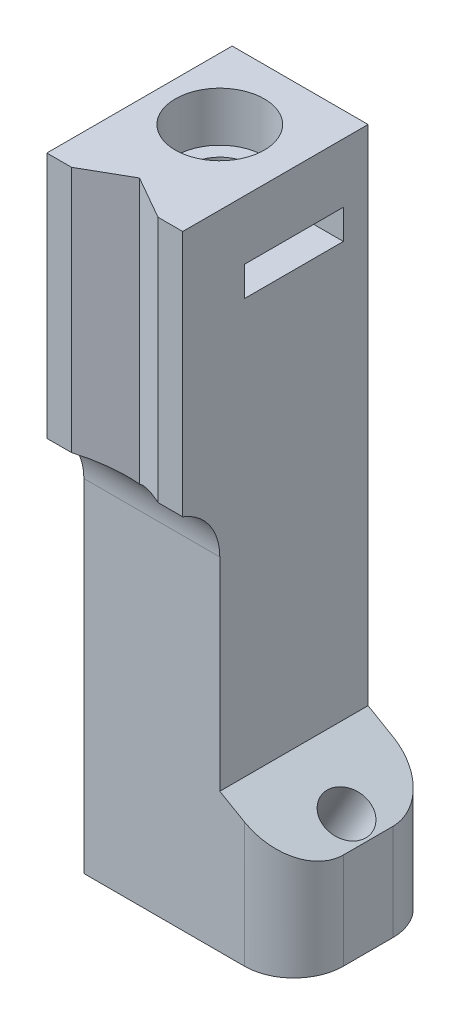
ISO-10303-21;
HEADER;
FILE_DESCRIPTION(('STEP AP214'),'2;1');
FILE_NAME('part.step','',(''),(''),'','','');
FILE_SCHEMA(('AUTOMOTIVE_DESIGN { 1 0 10303 214 1 1 1 1 }'));
ENDSEC;
DATA;
#1=APPLICATION_CONTEXT('core data for automotive mechanical design processes');
#2=APPLICATION_PROTOCOL_DEFINITION('international standard','automotive_design',2000,#1);
#3=PRODUCT_CONTEXT('',#1,'mechanical');
#4=PRODUCT('Part','Part','',(#3));
#5=PRODUCT_RELATED_PRODUCT_CATEGORY('part','',(#4));
#6=PRODUCT_DEFINITION_FORMATION('','',#4);
#7=PRODUCT_DEFINITION_CONTEXT('part definition',#1,'design');
#8=PRODUCT_DEFINITION('design','',#6,#7);
#9=PRODUCT_DEFINITION_SHAPE('','',#8);
#10=(LENGTH_UNIT() NAMED_UNIT(*) SI_UNIT(.MILLI.,.METRE.));
#11=(NAMED_UNIT(*) PLANE_ANGLE_UNIT() SI_UNIT($,.RADIAN.));
#12=(NAMED_UNIT(*) SI_UNIT($,.STERADIAN.) SOLID_ANGLE_UNIT());
#13=UNCERTAINTY_MEASURE_WITH_UNIT(LENGTH_MEASURE(1.E-05),#10,'distance_accuracy_value','');
#14=(GEOMETRIC_REPRESENTATION_CONTEXT(3) GLOBAL_UNCERTAINTY_ASSIGNED_CONTEXT((#13)) GLOBAL_UNIT_ASSIGNED_CONTEXT((#10,
#11,#12)) REPRESENTATION_CONTEXT('',''));
#15=CARTESIAN_POINT('',(0.,0.,0.));
#16=DIRECTION('',(0.,0.,1.));
#17=DIRECTION('',(1.,0.,0.));
#18=AXIS2_PLACEMENT_3D('',#15,#16,#17);
#19=CARTESIAN_POINT('',(2.50000000000003,19.75,0.));
#20=DIRECTION('',(0.,-1.,0.));
#21=DIRECTION('',(1.,0.,0.));
#22=AXIS2_PLACEMENT_3D('',#19,#20,#21);
#23=CYLINDRICAL_SURFACE('',#22,0.605);
#24=CARTESIAN_POINT('',(2.50000000000003,19.55,0.));
#25=DIRECTION('',(0.,1.,0.));
#26=DIRECTION('',(0.,0.,1.));
#27=AXIS2_PLACEMENT_3D('',#24,#25,#26);
#28=CIRCLE('',#27,0.605);
#29=CARTESIAN_POINT('',(2.50000000000003,19.55,0.605000000000023));
#30=VERTEX_POINT('',#29);
#31=EDGE_CURVE('E283',#30,#30,#28,.T.);
#32=ORIENTED_EDGE('',*,*,#31,.F.);
#33=EDGE_LOOP('',(#32));
#34=FACE_BOUND('',#33,.T.);
#35=CARTESIAN_POINT('',(2.50000000000003,19.75,0.));
#36=DIRECTION('',(0.,1.,0.));
#37=DIRECTION('',(-1.,0.,0.));
#38=AXIS2_PLACEMENT_3D('',#35,#36,#37);
#39=CIRCLE('',#38,0.605);
#40=CARTESIAN_POINT('',(1.89500000000003,19.75,0.));
#41=VERTEX_POINT('',#40);
#42=EDGE_CURVE('E365',#41,#41,#39,.T.);
#43=ORIENTED_EDGE('',*,*,#42,.T.);
#44=EDGE_LOOP('',(#43));
#45=FACE_BOUND('',#44,.T.);
#46=ADVANCED_FACE('F39',(#34,#45),#23,.F.);
#47=CARTESIAN_POINT('',(0.,0.,2.24999999996326));
#48=DIRECTION('',(0.,0.,-1.));
#49=DIRECTION('',(-1.,0.,0.));
#50=AXIS2_PLACEMENT_3D('',#47,#48,#49);
#51=PLANE('',#50);
#52=DIRECTION('',(1.,0.,0.));
#53=VECTOR('',#52,1.);
#54=CARTESIAN_POINT('',(4.00000000001019,15.75,2.24999999996326));
#55=LINE('',#54,#53);
#56=CARTESIAN_POINT('',(1.25000000001018,15.75,2.24999999996326));
#57=VERTEX_POINT('',#56);
#58=CARTESIAN_POINT('',(1.75000000001019,15.75,2.24999999996326));
#59=VERTEX_POINT('',#58);
#60=EDGE_CURVE('E409',#57,#59,#55,.T.);
#61=ORIENTED_EDGE('',*,*,#60,.T.);
#62=DIRECTION('',(0.,1.,0.));
#63=VECTOR('',#62,1.);
#64=CARTESIAN_POINT('',(1.75000000001014,0.,2.24999999996326));
#65=LINE('',#64,#63);
#66=CARTESIAN_POINT('',(1.7500000000102,20.75,2.24999999996327));
#67=VERTEX_POINT('',#66);
#68=EDGE_CURVE('E263',#59,#67,#65,.T.);
#69=ORIENTED_EDGE('',*,*,#68,.T.);
#70=DIRECTION('',(-1.,0.,0.));
#71=VECTOR('',#70,1.);
#72=CARTESIAN_POINT('',(4.00000000001018,20.75,2.24999999996326));
#73=LINE('',#72,#71);
#74=CARTESIAN_POINT('',(1.25000000001019,20.75,2.24999999996326));
#75=VERTEX_POINT('',#74);
#76=EDGE_CURVE('E422',#67,#75,#73,.T.);
#77=ORIENTED_EDGE('',*,*,#76,.T.);
#78=DIRECTION('',(0.,-1.,0.));
#79=VECTOR('',#78,1.);
#80=CARTESIAN_POINT('',(1.25000000001019,20.75,2.24999999996326));
#81=LINE('',#80,#79);
#82=EDGE_CURVE('E416',#75,#57,#81,.T.);
#83=ORIENTED_EDGE('',*,*,#82,.T.);
#84=EDGE_LOOP('',(#61,#69,#77,#83));
#85=FACE_BOUND('',#84,.T.);
#86=ADVANCED_FACE('F389',(#85),#51,.F.);
#87=CARTESIAN_POINT('',(0.,19.75,0.));
#88=DIRECTION('',(0.,1.,0.));
#89=DIRECTION('',(-1.,0.,0.));
#90=AXIS2_PLACEMENT_3D('',#87,#88,#89);
#91=PLANE('',#90);
#92=ORIENTED_EDGE('',*,*,#42,.F.);
#93=EDGE_LOOP('',(#92));
#94=FACE_BOUND('',#93,.T.);
#95=CARTESIAN_POINT('',(2.50000000000002,19.75,0.));
#96=DIRECTION('',(0.,1.,0.));
#97=DIRECTION('',(-1.,0.,0.));
#98=AXIS2_PLACEMENT_3D('',#95,#96,#97);
#99=CIRCLE('',#98,0.9);
#100=CARTESIAN_POINT('',(1.60000000000002,19.75,0.));
#101=VERTEX_POINT('',#100);
#102=EDGE_CURVE('E407',#101,#101,#99,.T.);
#103=ORIENTED_EDGE('',*,*,#102,.T.);
#104=EDGE_LOOP('',(#103));
#105=FACE_BOUND('',#104,.T.);
#106=ADVANCED_FACE('F395',(#94,#105),#91,.T.);
#107=CARTESIAN_POINT('',(0.,18.75,0.));
#108=DIRECTION('',(0.,1.,0.));
#109=DIRECTION('',(-1.,0.,0.));
#110=AXIS2_PLACEMENT_3D('',#107,#108,#109);
#111=PLANE('',#110);
#112=CARTESIAN_POINT('',(2.50000000000001,18.75,0.));
#113=DIRECTION('',(0.,1.,0.));
#114=DIRECTION('',(-1.,0.,0.));
#115=AXIS2_PLACEMENT_3D('',#112,#113,#114);
#116=CIRCLE('',#115,0.425);
#117=CARTESIAN_POINT('',(2.07500000000001,18.75,0.));
#118=VERTEX_POINT('',#117);
#119=EDGE_CURVE('E229',#118,#118,#116,.T.);
#120=ORIENTED_EDGE('',*,*,#119,.F.);
#121=EDGE_LOOP('',(#120));
#122=FACE_BOUND('',#121,.T.);
#123=CARTESIAN_POINT('',(2.50000000000003,18.75,0.));
#124=DIRECTION('',(0.,1.,0.));
#125=DIRECTION('',(-1.,0.,0.));
#126=AXIS2_PLACEMENT_3D('',#123,#124,#125);
#127=CIRCLE('',#126,0.605);
#128=CARTESIAN_POINT('',(1.89500000000003,18.75,0.));
#129=VERTEX_POINT('',#128);
#130=EDGE_CURVE('E359',#129,#129,#127,.T.);
#131=ORIENTED_EDGE('',*,*,#130,.T.);
#132=EDGE_LOOP('',(#131));
#133=FACE_BOUND('',#132,.T.);
#134=ADVANCED_FACE('F370',(#122,#133),#111,.T.);
#135=CARTESIAN_POINT('',(1.25000000001017,17.75,1.49999999996326));
#136=DIRECTION('',(-1.,0.,0.));
#137=DIRECTION('',(0.,0.,1.));
#138=AXIS2_PLACEMENT_3D('',#135,#136,#137);
#139=PLANE('',#138);
#140=DIRECTION('',(0.,-1.,0.));
#141=VECTOR('',#140,1.);
#142=CARTESIAN_POINT('',(1.25000000001017,18.95,-0.999999999963246));
#143=LINE('',#142,#141);
#144=CARTESIAN_POINT('',(1.25000000001017,19.55,-0.999999999963246));
#145=VERTEX_POINT('',#144);
#146=CARTESIAN_POINT('',(1.25000000001017,18.95,-0.999999999963245));
#147=VERTEX_POINT('',#146);
#148=EDGE_CURVE('E199',#145,#147,#143,.T.);
#149=ORIENTED_EDGE('',*,*,#148,.F.);
#150=DIRECTION('',(0.,0.,-1.));
#151=VECTOR('',#150,1.);
#152=CARTESIAN_POINT('',(1.25000000001017,19.55,-0.999999999963246));
#153=LINE('',#152,#151);
#154=CARTESIAN_POINT('',(1.25000000001017,19.55,1.00000000003675));
#155=VERTEX_POINT('',#154);
#156=EDGE_CURVE('E439',#155,#145,#153,.T.);
#157=ORIENTED_EDGE('',*,*,#156,.F.);
#158=DIRECTION('',(0.,1.,0.));
#159=VECTOR('',#158,1.);
#160=CARTESIAN_POINT('',(1.25000000001017,18.95,1.00000000003675));
#161=LINE('',#160,#159);
#162=CARTESIAN_POINT('',(1.25000000001017,18.95,1.00000000003675));
#163=VERTEX_POINT('',#162);
#164=EDGE_CURVE('E446',#163,#155,#161,.T.);
#165=ORIENTED_EDGE('',*,*,#164,.F.);
#166=DIRECTION('',(0.,0.,1.));
#167=VECTOR('',#166,1.);
#168=CARTESIAN_POINT('',(1.25000000001017,18.95,-0.999999999963246));
#169=LINE('',#168,#167);
#170=EDGE_CURVE('E449',#147,#163,#169,.T.);
#171=ORIENTED_EDGE('',*,*,#170,.F.);
#172=EDGE_LOOP('',(#149,#157,#165,#171));
#173=FACE_BOUND('',#172,.T.);
#174=DIRECTION('',(0.,0.,-1.));
#175=VECTOR('',#174,1.);
#176=CARTESIAN_POINT('',(1.25000000001017,7.75,1.49999999996326));
#177=LINE('',#176,#175);
#178=CARTESIAN_POINT('',(1.25000000001017,7.75,-0.787687442733548));
#179=VERTEX_POINT('',#178);
#180=CARTESIAN_POINT('',(1.25000000001017,7.75,-1.50000000003674));
#181=VERTEX_POINT('',#180);
#182=EDGE_CURVE('E232',#179,#181,#177,.T.);
#183=ORIENTED_EDGE('',*,*,#182,.F.);
#184=DIRECTION('',(0.,1.,0.));
#185=VECTOR('',#184,1.);
#186=CARTESIAN_POINT('',(1.25000000001017,17.75,-0.787687442733547));
#187=LINE('',#186,#185);
#188=CARTESIAN_POINT('',(1.25000000001017,17.75,-0.787687442733547));
#189=VERTEX_POINT('',#188);
#190=EDGE_CURVE('E225',#179,#189,#187,.T.);
#191=ORIENTED_EDGE('',*,*,#190,.T.);
#192=DIRECTION('',(0.,0.,1.));
#193=VECTOR('',#192,1.);
#194=CARTESIAN_POINT('',(1.25000000001017,17.75,1.49999999996326));
#195=LINE('',#194,#193);
#196=CARTESIAN_POINT('',(1.25000000001017,17.75,0.787687442733547));
#197=VERTEX_POINT('',#196);
#198=EDGE_CURVE('E257',#189,#197,#195,.T.);
#199=ORIENTED_EDGE('',*,*,#198,.T.);
#200=DIRECTION('',(0.,-1.,0.));
#201=VECTOR('',#200,1.);
#202=CARTESIAN_POINT('',(1.25000000001017,17.75,0.787687442733547));
#203=LINE('',#202,#201);
#204=CARTESIAN_POINT('',(1.25000000001017,7.75,0.787687442733547));
#205=VERTEX_POINT('',#204);
#206=EDGE_CURVE('E222',#197,#205,#203,.T.);
#207=ORIENTED_EDGE('',*,*,#206,.T.);
#208=CARTESIAN_POINT('',(1.25000000001017,7.75,1.49999999996326));
#209=VERTEX_POINT('',#208);
#210=EDGE_CURVE('E233',#209,#205,#177,.T.);
#211=ORIENTED_EDGE('',*,*,#210,.F.);
#212=DIRECTION('',(0.,-1.,0.));
#213=VECTOR('',#212,1.);
#214=CARTESIAN_POINT('',(1.25000000001017,17.75,1.49999999996326));
#215=LINE('',#214,#213);
#216=CARTESIAN_POINT('',(1.25000000001017,14.6718070673576,1.49999999996326));
#217=VERTEX_POINT('',#216);
#218=EDGE_CURVE('E242',#217,#209,#215,.T.);
#219=ORIENTED_EDGE('',*,*,#218,.F.);
#220=CARTESIAN_POINT('',(1.25000000001017,14.6718070673576,2.64999999996326));
#221=DIRECTION('',(-1.,0.,0.));
#222=DIRECTION('',(0.,0.,1.));
#223=AXIS2_PLACEMENT_3D('',#220,#221,#222);
#224=CIRCLE('',#223,1.15);
#225=EDGE_CURVE('E275',#217,#57,#224,.F.);
#226=ORIENTED_EDGE('',*,*,#225,.T.);
#227=ORIENTED_EDGE('',*,*,#82,.F.);
#228=DIRECTION('',(0.,0.,1.));
#229=VECTOR('',#228,1.);
#230=CARTESIAN_POINT('',(1.25000000001019,20.75,-1.49999999996325));
#231=LINE('',#230,#229);
#232=CARTESIAN_POINT('',(1.25000000001019,20.75,-1.49999999996325));
#233=VERTEX_POINT('',#232);
#234=EDGE_CURVE('E348',#233,#75,#231,.T.);
#235=ORIENTED_EDGE('',*,*,#234,.F.);
#236=DIRECTION('',(0.,-1.,0.));
#237=VECTOR('',#236,1.);
#238=CARTESIAN_POINT('',(1.25000000001017,17.75,-1.50000000003674));
#239=LINE('',#238,#237);
#240=EDGE_CURVE('E241',#233,#181,#239,.T.);
#241=ORIENTED_EDGE('',*,*,#240,.T.);
#242=EDGE_LOOP('',(#183,#191,#199,#207,#211,#219,#226,#227,#235,#241));
#243=FACE_BOUND('',#242,.T.);
#244=ADVANCED_FACE('F342',(#173,#243),#139,.T.);
#245=CARTESIAN_POINT('',(0.,7.75,0.));
#246=DIRECTION('',(0.,1.,0.));
#247=DIRECTION('',(0.,0.,1.));
#248=AXIS2_PLACEMENT_3D('',#245,#246,#247);
#249=PLANE('',#248);
#250=CARTESIAN_POINT('',(2.5,7.75,0.));
#251=DIRECTION('',(0.,1.,0.));
#252=DIRECTION('',(0.,0.,-1.));
#253=AXIS2_PLACEMENT_3D('',#250,#251,#252);
#254=CIRCLE('',#253,0.825000000000001);
#255=CARTESIAN_POINT('',(2.47513758544198,7.75,0.824625284806587));
#256=VERTEX_POINT('',#255);
#257=CARTESIAN_POINT('',(3.3088331618986,7.75,0.162523586636277));
#258=VERTEX_POINT('',#257);
#259=EDGE_CURVE('E198',#256,#258,#254,.T.);
#260=ORIENTED_EDGE('',*,*,#259,.T.);
#261=CARTESIAN_POINT('',(3.79337567298423,7.75,0.));
#262=DIRECTION('',(0.,1.,0.));
#263=DIRECTION('',(1.,0.,0.));
#264=AXIS2_PLACEMENT_3D('',#261,#262,#263);
#265=ELLIPSE('',#264,0.519615242270661,0.45);
#266=CARTESIAN_POINT('',(3.3088331618986,7.75,-0.16252358663628));
#267=VERTEX_POINT('',#266);
#268=EDGE_CURVE('E53',#258,#267,#265,.T.);
#269=ORIENTED_EDGE('',*,*,#268,.T.);
#270=CARTESIAN_POINT('',(2.47513758544198,7.75,-0.824625284806589));
#271=VERTEX_POINT('',#270);
#272=EDGE_CURVE('E195',#267,#271,#254,.T.);
#273=ORIENTED_EDGE('',*,*,#272,.T.);
#274=DIRECTION('',(-0.99954579976556,0.,0.0301362600703328));
#275=VECTOR('',#274,1.);
#276=CARTESIAN_POINT('',(0.,7.75,-0.75));
#277=LINE('',#276,#275);
#278=EDGE_CURVE('E208',#271,#179,#277,.T.);
#279=ORIENTED_EDGE('',*,*,#278,.T.);
#280=ORIENTED_EDGE('',*,*,#182,.T.);
#281=DIRECTION('',(1.,0.,2.67195514451353E-11));
#282=VECTOR('',#281,1.);
#283=CARTESIAN_POINT('',(4.00000000001017,7.75,-1.49999999996326));
#284=LINE('',#283,#282);
#285=CARTESIAN_POINT('',(4.50000000003691,7.75,-1.4999999999499));
#286=VERTEX_POINT('',#285);
#287=EDGE_CURVE('E236',#181,#286,#284,.T.);
#288=ORIENTED_EDGE('',*,*,#287,.T.);
#289=CARTESIAN_POINT('',(4.50000000001019,7.75,-0.499999999949901));
#290=DIRECTION('',(0.,1.,0.));
#291=DIRECTION('',(0.,0.,1.));
#292=AXIS2_PLACEMENT_3D('',#289,#290,#291);
#293=CIRCLE('',#292,1.);
#294=CARTESIAN_POINT('',(5.50000000001019,7.75,-0.499999999949901));
#295=VERTEX_POINT('',#294);
#296=EDGE_CURVE('E47',#286,#295,#293,.F.);
#297=ORIENTED_EDGE('',*,*,#296,.T.);
#298=DIRECTION('',(0.,0.,1.));
#299=VECTOR('',#298,1.);
#300=CARTESIAN_POINT('',(5.50000000001019,7.75,-4.69061108165771));
#301=LINE('',#300,#299);
#302=CARTESIAN_POINT('',(5.50000000001019,7.75,0.499999999963262));
#303=VERTEX_POINT('',#302);
#304=EDGE_CURVE('E304',#295,#303,#301,.T.);
#305=ORIENTED_EDGE('',*,*,#304,.T.);
#306=CARTESIAN_POINT('',(4.50000000001019,7.75,0.499999999963261));
#307=DIRECTION('',(0.,1.,0.));
#308=DIRECTION('',(0.,0.,1.));
#309=AXIS2_PLACEMENT_3D('',#306,#307,#308);
#310=CIRCLE('',#309,1.);
#311=CARTESIAN_POINT('',(4.50000000001019,7.75,1.49999999996326));
#312=VERTEX_POINT('',#311);
#313=EDGE_CURVE('E61',#303,#312,#310,.F.);
#314=ORIENTED_EDGE('',*,*,#313,.T.);
#315=DIRECTION('',(-1.,0.,0.));
#316=VECTOR('',#315,1.);
#317=CARTESIAN_POINT('',(4.00000000001017,7.75,1.49999999996326));
#318=LINE('',#317,#316);
#319=EDGE_CURVE('E239',#312,#209,#318,.T.);
#320=ORIENTED_EDGE('',*,*,#319,.T.);
#321=ORIENTED_EDGE('',*,*,#210,.T.);
#322=DIRECTION('',(-0.99954579976556,0.,-0.0301362600703316));
#323=VECTOR('',#322,1.);
#324=CARTESIAN_POINT('',(-0.0225919291304569,7.75,0.749318854371731));
#325=LINE('',#324,#323);
#326=EDGE_CURVE('E245',#256,#205,#325,.T.);
#327=ORIENTED_EDGE('',*,*,#326,.F.);
#328=EDGE_LOOP('',(#260,#269,#273,#279,#280,#288,#297,#305,#314,#320,#321,#327));
#329=FACE_BOUND('',#328,.T.);
#330=ADVANCED_FACE('F193',(#329),#249,.F.);
#331=CARTESIAN_POINT('',(4.00000000001017,17.75,1.49999999996326));
#332=DIRECTION('',(0.,0.,1.));
#333=DIRECTION('',(1.,0.,0.));
#334=AXIS2_PLACEMENT_3D('',#331,#332,#333);
#335=PLANE('',#334);
#336=ORIENTED_EDGE('',*,*,#319,.F.);
#337=DIRECTION('',(0.,1.,0.));
#338=VECTOR('',#337,1.);
#339=CARTESIAN_POINT('',(4.50000000001019,17.75,1.49999999996326));
#340=LINE('',#339,#338);
#341=CARTESIAN_POINT('',(4.50000000001019,10.2773502691896,1.49999999996326));
#342=VERTEX_POINT('',#341);
#343=EDGE_CURVE('E11',#312,#342,#340,.T.);
#344=ORIENTED_EDGE('',*,*,#343,.T.);
#345=DIRECTION('',(-0.866025403784443,0.499999999999993,0.));
#346=VECTOR('',#345,1.);
#347=CARTESIAN_POINT('',(5.5000000000102,9.7,1.49999999996326));
#348=LINE('',#347,#346);
#349=CARTESIAN_POINT('',(4.00000000001018,10.5660254037844,1.49999999996326));
#350=VERTEX_POINT('',#349);
#351=EDGE_CURVE('E315',#342,#350,#348,.T.);
#352=ORIENTED_EDGE('',*,*,#351,.T.);
#353=DIRECTION('',(0.,-1.,0.));
#354=VECTOR('',#353,1.);
#355=CARTESIAN_POINT('',(4.00000000001017,17.75,1.49999999996326));
#356=LINE('',#355,#354);
#357=CARTESIAN_POINT('',(4.00000000001017,14.6718070673576,1.49999999996326));
#358=VERTEX_POINT('',#357);
#359=EDGE_CURVE('E246',#358,#350,#356,.T.);
#360=ORIENTED_EDGE('',*,*,#359,.F.);
#361=DIRECTION('',(1.,0.,0.));
#362=VECTOR('',#361,1.);
#363=CARTESIAN_POINT('',(1.25000000001017,14.6718070673576,1.49999999996326));
#364=LINE('',#363,#362);
#365=EDGE_CURVE('E266',#358,#217,#364,.F.);
#366=ORIENTED_EDGE('',*,*,#365,.T.);
#367=ORIENTED_EDGE('',*,*,#218,.T.);
#368=EDGE_LOOP('',(#336,#344,#352,#360,#366,#367));
#369=FACE_BOUND('',#368,.T.);
#370=ADVANCED_FACE('F666',(#369),#335,.T.);
#371=CARTESIAN_POINT('',(4.00000000001017,17.75,1.49999999996326));
#372=DIRECTION('',(1.,0.,0.));
#373=DIRECTION('',(0.,0.,-1.));
#374=AXIS2_PLACEMENT_3D('',#371,#372,#373);
#375=PLANE('',#374);
#376=DIRECTION('',(0.,1.,0.));
#377=VECTOR('',#376,1.);
#378=CARTESIAN_POINT('',(4.00000000001017,17.75,-0.999999999963246));
#379=LINE('',#378,#377);
#380=CARTESIAN_POINT('',(4.00000000001017,18.95,-0.999999999963246));
#381=VERTEX_POINT('',#380);
#382=CARTESIAN_POINT('',(4.00000000001017,19.55,-0.999999999963246));
#383=VERTEX_POINT('',#382);
#384=EDGE_CURVE('E289',#381,#383,#379,.T.);
#385=ORIENTED_EDGE('',*,*,#384,.F.);
#386=DIRECTION('',(0.,0.,-1.));
#387=VECTOR('',#386,1.);
#388=CARTESIAN_POINT('',(4.00000000001017,18.95,1.49999999996326));
#389=LINE('',#388,#387);
#390=CARTESIAN_POINT('',(4.00000000001017,18.95,1.00000000003675));
#391=VERTEX_POINT('',#390);
#392=EDGE_CURVE('E281',#391,#381,#389,.T.);
#393=ORIENTED_EDGE('',*,*,#392,.F.);
#394=DIRECTION('',(0.,-1.,0.));
#395=VECTOR('',#394,1.);
#396=CARTESIAN_POINT('',(4.00000000001017,17.75,1.00000000003675));
#397=LINE('',#396,#395);
#398=CARTESIAN_POINT('',(4.00000000001017,19.55,1.00000000003675));
#399=VERTEX_POINT('',#398);
#400=EDGE_CURVE('E277',#399,#391,#397,.T.);
#401=ORIENTED_EDGE('',*,*,#400,.F.);
#402=DIRECTION('',(0.,0.,1.));
#403=VECTOR('',#402,1.);
#404=CARTESIAN_POINT('',(4.00000000001017,19.55,1.49999999996326));
#405=LINE('',#404,#403);
#406=EDGE_CURVE('E286',#383,#399,#405,.T.);
#407=ORIENTED_EDGE('',*,*,#406,.F.);
#408=EDGE_LOOP('',(#385,#393,#401,#407));
#409=FACE_BOUND('',#408,.T.);
#410=DIRECTION('',(0.,0.,1.));
#411=VECTOR('',#410,1.);
#412=CARTESIAN_POINT('',(4.00000000001018,10.5660254037844,-4.69061108165771));
#413=LINE('',#412,#411);
#414=CARTESIAN_POINT('',(4.00000000001017,10.5660254037844,-1.49999999996326));
#415=VERTEX_POINT('',#414);
#416=EDGE_CURVE('E206',#415,#350,#413,.T.);
#417=ORIENTED_EDGE('',*,*,#416,.F.);
#418=DIRECTION('',(0.,-1.,0.));
#419=VECTOR('',#418,1.);
#420=CARTESIAN_POINT('',(4.00000000001017,17.75,-1.49999999996326));
#421=LINE('',#420,#419);
#422=CARTESIAN_POINT('',(4.00000000001019,20.75,-1.49999999996325));
#423=VERTEX_POINT('',#422);
#424=EDGE_CURVE('E249',#423,#415,#421,.T.);
#425=ORIENTED_EDGE('',*,*,#424,.F.);
#426=DIRECTION('',(0.,0.,-1.));
#427=VECTOR('',#426,1.);
#428=CARTESIAN_POINT('',(4.00000000001019,20.75,-1.49999999996325));
#429=LINE('',#428,#427);
#430=CARTESIAN_POINT('',(4.00000000001018,20.75,2.24999999996326));
#431=VERTEX_POINT('',#430);
#432=EDGE_CURVE('E357',#431,#423,#429,.T.);
#433=ORIENTED_EDGE('',*,*,#432,.F.);
#434=DIRECTION('',(0.,1.,0.));
#435=VECTOR('',#434,1.);
#436=CARTESIAN_POINT('',(4.00000000001018,20.75,2.24999999996326));
#437=LINE('',#436,#435);
#438=CARTESIAN_POINT('',(4.00000000001019,15.75,2.24999999996326));
#439=VERTEX_POINT('',#438);
#440=EDGE_CURVE('E423',#439,#431,#437,.T.);
#441=ORIENTED_EDGE('',*,*,#440,.F.);
#442=CARTESIAN_POINT('',(4.00000000001017,14.6718070673576,2.64999999996326));
#443=DIRECTION('',(1.,0.,0.));
#444=DIRECTION('',(0.,0.,-1.));
#445=AXIS2_PLACEMENT_3D('',#442,#443,#444);
#446=CIRCLE('',#445,1.15);
#447=EDGE_CURVE('E273',#439,#358,#446,.F.);
#448=ORIENTED_EDGE('',*,*,#447,.T.);
#449=ORIENTED_EDGE('',*,*,#359,.T.);
#450=EDGE_LOOP('',(#417,#425,#433,#441,#448,#449));
#451=FACE_BOUND('',#450,.T.);
#452=ADVANCED_FACE('F646',(#409,#451),#375,.T.);
#453=CARTESIAN_POINT('',(4.00000000001017,17.75,-1.49999999996326));
#454=DIRECTION('',(2.67195514451353E-11,0.,-1.));
#455=DIRECTION('',(-1.,0.,-2.67195514451353E-11));
#456=AXIS2_PLACEMENT_3D('',#453,#454,#455);
#457=PLANE('',#456);
#458=DIRECTION('',(-0.866025403784443,0.499999999999993,-2.31398103292125E-11));
#459=VECTOR('',#458,1.);
#460=CARTESIAN_POINT('',(5.49999999994626,9.70000000003692,-1.49999999992318));
#461=LINE('',#460,#459);
#462=CARTESIAN_POINT('',(4.50000000003691,10.2773502691742,-1.4999999999499));
#463=VERTEX_POINT('',#462);
#464=EDGE_CURVE('E210',#463,#415,#461,.T.);
#465=ORIENTED_EDGE('',*,*,#464,.F.);
#466=DIRECTION('',(0.,1.,0.));
#467=VECTOR('',#466,1.);
#468=CARTESIAN_POINT('',(4.50000000003691,17.75,-1.4999999999499));
#469=LINE('',#468,#467);
#470=EDGE_CURVE('E300',#463,#286,#469,.F.);
#471=ORIENTED_EDGE('',*,*,#470,.T.);
#472=ORIENTED_EDGE('',*,*,#287,.F.);
#473=ORIENTED_EDGE('',*,*,#240,.F.);
#474=DIRECTION('',(-1.,0.,0.));
#475=VECTOR('',#474,1.);
#476=CARTESIAN_POINT('',(4.00000000001019,20.75,-1.49999999996325));
#477=LINE('',#476,#475);
#478=EDGE_CURVE('E350',#423,#233,#477,.T.);
#479=ORIENTED_EDGE('',*,*,#478,.F.);
#480=ORIENTED_EDGE('',*,*,#424,.T.);
#481=EDGE_LOOP('',(#465,#471,#472,#473,#479,#480));
#482=FACE_BOUND('',#481,.T.);
#483=ADVANCED_FACE('F323',(#482),#457,.T.);
#484=CARTESIAN_POINT('',(2.50000000000001,18.75,0.));
#485=DIRECTION('',(0.,-1.,0.));
#486=DIRECTION('',(1.,0.,0.));
#487=AXIS2_PLACEMENT_3D('',#484,#485,#486);
#488=CYLINDRICAL_SURFACE('',#487,0.425);
#489=ORIENTED_EDGE('',*,*,#119,.T.);
#490=EDGE_LOOP('',(#489));
#491=FACE_BOUND('',#490,.T.);
#492=CARTESIAN_POINT('',(2.50000000000001,17.75,0.));
#493=DIRECTION('',(0.,1.,0.));
#494=DIRECTION('',(0.,0.,1.));
#495=AXIS2_PLACEMENT_3D('',#492,#493,#494);
#496=CIRCLE('',#495,0.425);
#497=CARTESIAN_POINT('',(2.50000000000001,17.75,0.425000000000002));
#498=VERTEX_POINT('',#497);
#499=EDGE_CURVE('E228',#498,#498,#496,.F.);
#500=ORIENTED_EDGE('',*,*,#499,.T.);
#501=EDGE_LOOP('',(#500));
#502=FACE_BOUND('',#501,.T.);
#503=ADVANCED_FACE('F632',(#491,#502),#488,.F.);
#504=CARTESIAN_POINT('',(2.5,17.75,0.));
#505=DIRECTION('',(0.,-1.,0.));
#506=DIRECTION('',(0.,0.,-1.));
#507=AXIS2_PLACEMENT_3D('',#504,#505,#506);
#508=CYLINDRICAL_SURFACE('',#507,0.825000000000001);
#509=CARTESIAN_POINT('',(3.3088331618986,7.75,0.162523586636281));
#510=CARTESIAN_POINT('',(3.31130298301363,7.76381074017904,0.150157062556384));
#511=CARTESIAN_POINT('',(3.31371865886534,7.77717541121343,0.136734291079579));
#512=CARTESIAN_POINT('',(3.31813522489229,7.80146061221009,0.107301244271355));
#513=CARTESIAN_POINT('',(3.32012536097923,7.81231822855201,0.0912387966053799));
#514=CARTESIAN_POINT('',(3.32241990837611,7.8247883181701,0.0657054587576099));
#515=CARTESIAN_POINT('',(3.32306054392863,7.82826052689777,0.0572075590074394));
#516=CARTESIAN_POINT('',(3.32408501472451,7.83380672514012,0.0398053806079432));
#517=CARTESIAN_POINT('',(3.32447053671383,7.83588989931216,0.0309041955707023));
#518=CARTESIAN_POINT('',(3.32495108097547,7.8384857744639,0.0127802242978498));
#519=CARTESIAN_POINT('',(3.32504351428764,7.83898447931983,0.00355529577785323));
#520=CARTESIAN_POINT('',(3.32491787803019,7.83830615950752,-0.0148426444433378));
#521=CARTESIAN_POINT('',(3.32469934621167,7.83712664016349,-0.0240155584629134));
#522=CARTESIAN_POINT('',(3.32400506441491,7.83337350277898,-0.0413613621300416));
#523=CARTESIAN_POINT('',(3.32354887941204,7.83090589989695,-0.0495587976920373));
#524=CARTESIAN_POINT('',(3.32243358604487,7.82486094685297,-0.0655138902923301));
#525=CARTESIAN_POINT('',(3.32177437328802,7.82128302578184,-0.0732713186527857));
#526=CARTESIAN_POINT('',(3.3197627826597,7.81033709213271,-0.0937188300484667));
#527=CARTESIAN_POINT('',(3.31825366653092,7.80209822471133,-0.105924289415646));
#528=CARTESIAN_POINT('',(3.31494523566545,7.78392951620601,-0.128940250959091));
#529=CARTESIAN_POINT('',(3.31314523829414,7.77399569429561,-0.139747361381362));
#530=CARTESIAN_POINT('',(3.31046334897833,7.75909499018411,-0.154248139016151));
#531=CARTESIAN_POINT('',(3.30965396934797,7.75458618683261,-0.158434434744402));
#532=CARTESIAN_POINT('',(3.3088331618986,7.75000000000001,-0.162523586636297));
#533=B_SPLINE_CURVE_WITH_KNOTS('',3,(#509,#510,#511,#512,#513,#514,#515,#516,#517,#518,#519,
#520,#521,#522,#523,#524,#525,#526,#527,#528,#529,#530,#531,#532),.UNSPECIFIED.,.F.,.F.,(4,2,2,
2,2,2,2,2,2,2,2,4),(0.,0.0566776770472456,0.114652052950472,0.142154106852181,0.169472457382965,
0.197031458225634,0.224631468275562,0.25025265466321,0.275887036975723,0.320038341536252,
0.364294805787561,0.382901662172596),.UNSPECIFIED.);
#534=EDGE_CURVE('E186',#258,#267,#533,.T.);
#535=ORIENTED_EDGE('',*,*,#534,.F.);
#536=ORIENTED_EDGE('',*,*,#259,.F.);
#537=DIRECTION('',(0.,-1.,0.));
#538=VECTOR('',#537,1.);
#539=CARTESIAN_POINT('',(2.47513758544198,17.75,0.824625284806587));
#540=LINE('',#539,#538);
#541=CARTESIAN_POINT('',(2.47513758544198,17.75,0.824625284806587));
#542=VERTEX_POINT('',#541);
#543=EDGE_CURVE('E218',#542,#256,#540,.T.);
#544=ORIENTED_EDGE('',*,*,#543,.F.);
#545=CARTESIAN_POINT('',(2.5,17.75,0.));
#546=DIRECTION('',(0.,1.,0.));
#547=DIRECTION('',(0.,0.,-1.));
#548=AXIS2_PLACEMENT_3D('',#545,#546,#547);
#549=CIRCLE('',#548,0.825000000000001);
#550=CARTESIAN_POINT('',(2.47513758544198,17.75,-0.824625284806589));
#551=VERTEX_POINT('',#550);
#552=EDGE_CURVE('E217',#542,#551,#549,.T.);
#553=ORIENTED_EDGE('',*,*,#552,.T.);
#554=DIRECTION('',(0.,-1.,0.));
#555=VECTOR('',#554,1.);
#556=CARTESIAN_POINT('',(2.47513758544198,17.75,-0.824625284806589));
#557=LINE('',#556,#555);
#558=EDGE_CURVE('E205',#551,#271,#557,.T.);
#559=ORIENTED_EDGE('',*,*,#558,.T.);
#560=ORIENTED_EDGE('',*,*,#272,.F.);
#561=EDGE_LOOP('',(#535,#536,#544,#553,#559,#560));
#562=FACE_BOUND('',#561,.T.);
#563=ADVANCED_FACE('F202',(#562),#508,.F.);
#564=CARTESIAN_POINT('',(0.,17.75,-0.75));
#565=DIRECTION('',(0.0301362600703328,0.,0.99954579976556));
#566=DIRECTION('',(0.99954579976556,0.,-0.0301362600703328));
#567=AXIS2_PLACEMENT_3D('',#564,#565,#566);
#568=PLANE('',#567);
#569=ORIENTED_EDGE('',*,*,#278,.F.);
#570=ORIENTED_EDGE('',*,*,#558,.F.);
#571=DIRECTION('',(-0.99954579976556,0.,0.0301362600703328));
#572=VECTOR('',#571,1.);
#573=CARTESIAN_POINT('',(0.,17.75,-0.75));
#574=LINE('',#573,#572);
#575=EDGE_CURVE('E330',#551,#189,#574,.T.);
#576=ORIENTED_EDGE('',*,*,#575,.T.);
#577=ORIENTED_EDGE('',*,*,#190,.F.);
#578=EDGE_LOOP('',(#569,#570,#576,#577));
#579=FACE_BOUND('',#578,.T.);
#580=ADVANCED_FACE('F344',(#579),#568,.T.);
#581=CARTESIAN_POINT('',(0.,17.75,0.750000000000001));
#582=DIRECTION('',(0.0301362600703316,0.,-0.99954579976556));
#583=DIRECTION('',(-0.99954579976556,0.,-0.0301362600703316));
#584=AXIS2_PLACEMENT_3D('',#581,#582,#583);
#585=PLANE('',#584);
#586=DIRECTION('',(0.99954579976556,0.,0.0301362600703316));
#587=VECTOR('',#586,1.);
#588=CARTESIAN_POINT('',(0.,17.75,0.750000000000001));
#589=LINE('',#588,#587);
#590=EDGE_CURVE('E214',#197,#542,#589,.T.);
#591=ORIENTED_EDGE('',*,*,#590,.T.);
#592=ORIENTED_EDGE('',*,*,#543,.T.);
#593=ORIENTED_EDGE('',*,*,#326,.T.);
#594=ORIENTED_EDGE('',*,*,#206,.F.);
#595=EDGE_LOOP('',(#591,#592,#593,#594));
#596=FACE_BOUND('',#595,.T.);
#597=ADVANCED_FACE('F336',(#596),#585,.T.);
#598=CARTESIAN_POINT('',(2.5,17.75,0.));
#599=DIRECTION('',(0.,-1.,0.));
#600=DIRECTION('',(0.,0.,-1.));
#601=AXIS2_PLACEMENT_3D('',#598,#599,#600);
#602=PLANE('',#601);
#603=ORIENTED_EDGE('',*,*,#499,.F.);
#604=EDGE_LOOP('',(#603));
#605=FACE_BOUND('',#604,.T.);
#606=ORIENTED_EDGE('',*,*,#575,.F.);
#607=ORIENTED_EDGE('',*,*,#552,.F.);
#608=ORIENTED_EDGE('',*,*,#590,.F.);
#609=ORIENTED_EDGE('',*,*,#198,.F.);
#610=EDGE_LOOP('',(#606,#607,#608,#609));
#611=FACE_BOUND('',#610,.T.);
#612=ADVANCED_FACE('F339',(#605,#611),#602,.T.);
#613=CARTESIAN_POINT('',(5.50000000001019,7.75,-4.69061108165771));
#614=DIRECTION('',(1.,0.,0.));
#615=DIRECTION('',(0.,0.,-1.));
#616=AXIS2_PLACEMENT_3D('',#613,#614,#615);
#617=PLANE('',#616);
#618=ORIENTED_EDGE('',*,*,#304,.F.);
#619=DIRECTION('',(0.,1.,0.));
#620=VECTOR('',#619,1.);
#621=CARTESIAN_POINT('',(5.50000000001019,7.75,-0.499999999949901));
#622=LINE('',#621,#620);
#623=CARTESIAN_POINT('',(5.50000000001019,9.7,-0.499999999949901));
#624=VERTEX_POINT('',#623);
#625=EDGE_CURVE('E293',#295,#624,#622,.T.);
#626=ORIENTED_EDGE('',*,*,#625,.T.);
#627=DIRECTION('',(0.,0.,1.));
#628=VECTOR('',#627,1.);
#629=CARTESIAN_POINT('',(5.50000000001019,9.7,-4.69061108165771));
#630=LINE('',#629,#628);
#631=CARTESIAN_POINT('',(5.50000000001019,9.7,0.499999999963262));
#632=VERTEX_POINT('',#631);
#633=EDGE_CURVE('E314',#624,#632,#630,.T.);
#634=ORIENTED_EDGE('',*,*,#633,.T.);
#635=DIRECTION('',(0.,1.,0.));
#636=VECTOR('',#635,1.);
#637=CARTESIAN_POINT('',(5.50000000001019,7.75,0.499999999963262));
#638=LINE('',#637,#636);
#639=EDGE_CURVE('E291',#632,#303,#638,.F.);
#640=ORIENTED_EDGE('',*,*,#639,.T.);
#641=EDGE_LOOP('',(#618,#626,#634,#640));
#642=FACE_BOUND('',#641,.T.);
#643=ADVANCED_FACE('F310',(#642),#617,.T.);
#644=CARTESIAN_POINT('',(5.50000000001019,9.7,-4.69061108165771));
#645=DIRECTION('',(0.499999999999993,0.866025403784443,0.));
#646=DIRECTION('',(-0.866025403784443,0.499999999999993,0.));
#647=AXIS2_PLACEMENT_3D('',#644,#645,#646);
#648=PLANE('',#647);
#649=CARTESIAN_POINT('',(5.06440652343053,9.95149001096051,0.));
#650=DIRECTION('',(0.499999999999993,0.866025403784443,0.));
#651=DIRECTION('',(-0.866025403784443,0.499999999999993,0.));
#652=AXIS2_PLACEMENT_3D('',#649,#650,#651);
#653=CIRCLE('',#652,0.45);
#654=CARTESIAN_POINT('',(4.67469509172753,10.1764900109605,0.));
#655=VERTEX_POINT('',#654);
#656=EDGE_CURVE('E191',#655,#655,#653,.T.);
#657=ORIENTED_EDGE('',*,*,#656,.F.);
#658=EDGE_LOOP('',(#657));
#659=FACE_BOUND('',#658,.T.);
#660=ORIENTED_EDGE('',*,*,#633,.F.);
#661=CARTESIAN_POINT('',(4.50000000001019,10.2773502691896,-0.499999999949901));
#662=DIRECTION('',(0.499999999999993,0.866025403784443,0.));
#663=DIRECTION('',(-0.866025403784443,0.499999999999993,0.));
#664=AXIS2_PLACEMENT_3D('',#661,#662,#663);
#665=ELLIPSE('',#664,1.15470053837925,1.);
#666=EDGE_CURVE('E298',#624,#463,#665,.T.);
#667=ORIENTED_EDGE('',*,*,#666,.T.);
#668=ORIENTED_EDGE('',*,*,#464,.T.);
#669=ORIENTED_EDGE('',*,*,#416,.T.);
#670=ORIENTED_EDGE('',*,*,#351,.F.);
#671=CARTESIAN_POINT('',(4.50000000001019,10.2773502691896,0.499999999963261));
#672=DIRECTION('',(0.499999999999993,0.866025403784443,0.));
#673=DIRECTION('',(-0.866025403784443,0.499999999999993,0.));
#674=AXIS2_PLACEMENT_3D('',#671,#672,#673);
#675=ELLIPSE('',#674,1.15470053837925,1.);
#676=EDGE_CURVE('E296',#342,#632,#675,.T.);
#677=ORIENTED_EDGE('',*,*,#676,.T.);
#678=EDGE_LOOP('',(#660,#667,#668,#669,#670,#677));
#679=FACE_BOUND('',#678,.T.);
#680=ADVANCED_FACE('F320',(#659,#679),#648,.T.);
#681=CARTESIAN_POINT('',(2.50000000000003,18.95,0.));
#682=DIRECTION('',(0.,-1.,0.));
#683=DIRECTION('',(0.,0.,-1.));
#684=AXIS2_PLACEMENT_3D('',#681,#682,#683);
#685=CIRCLE('',#684,0.605);
#686=CARTESIAN_POINT('',(2.50000000000003,18.95,-0.604999999999978));
#687=VERTEX_POINT('',#686);
#688=EDGE_CURVE('E278',#687,#687,#685,.T.);
#689=ORIENTED_EDGE('',*,*,#688,.F.);
#690=EDGE_LOOP('',(#689));
#691=FACE_BOUND('',#690,.T.);
#692=ORIENTED_EDGE('',*,*,#130,.F.);
#693=EDGE_LOOP('',(#692));
#694=FACE_BOUND('',#693,.T.);
#695=ADVANCED_FACE('F372',(#691,#694),#23,.F.);
#696=CARTESIAN_POINT('',(0.,20.75,0.));
#697=DIRECTION('',(0.,-1.,0.));
#698=DIRECTION('',(1.,0.,0.));
#699=AXIS2_PLACEMENT_3D('',#696,#697,#698);
#700=PLANE('',#699);
#701=ORIENTED_EDGE('',*,*,#76,.F.);
#702=DIRECTION('',(-0.868243142124459,0.,0.496138938356834));
#703=VECTOR('',#702,1.);
#704=CARTESIAN_POINT('',(1.7500000000102,20.75,2.24999999996327));
#705=LINE('',#704,#703);
#706=CARTESIAN_POINT('',(2.6250000000102,20.75,1.74999999996327));
#707=VERTEX_POINT('',#706);
#708=EDGE_CURVE('E428',#707,#67,#705,.T.);
#709=ORIENTED_EDGE('',*,*,#708,.F.);
#710=DIRECTION('',(-0.868243142124459,0.,-0.496138938356834));
#711=VECTOR('',#710,1.);
#712=CARTESIAN_POINT('',(2.6250000000102,20.75,1.74999999996327));
#713=LINE('',#712,#711);
#714=CARTESIAN_POINT('',(3.5000000000102,20.75,2.24999999996327));
#715=VERTEX_POINT('',#714);
#716=EDGE_CURVE('E430',#715,#707,#713,.T.);
#717=ORIENTED_EDGE('',*,*,#716,.F.);
#718=EDGE_CURVE('E419',#431,#715,#73,.T.);
#719=ORIENTED_EDGE('',*,*,#718,.F.);
#720=ORIENTED_EDGE('',*,*,#432,.T.);
#721=ORIENTED_EDGE('',*,*,#478,.T.);
#722=ORIENTED_EDGE('',*,*,#234,.T.);
#723=EDGE_LOOP('',(#701,#709,#717,#719,#720,#721,#722));
#724=FACE_BOUND('',#723,.T.);
#725=CARTESIAN_POINT('',(2.50000000000002,20.75,0.));
#726=DIRECTION('',(0.,1.,0.));
#727=DIRECTION('',(-1.,0.,0.));
#728=AXIS2_PLACEMENT_3D('',#725,#726,#727);
#729=CIRCLE('',#728,0.9);
#730=CARTESIAN_POINT('',(1.60000000000002,20.75,0.));
#731=VERTEX_POINT('',#730);
#732=EDGE_CURVE('E361',#731,#731,#729,.T.);
#733=ORIENTED_EDGE('',*,*,#732,.F.);
#734=EDGE_LOOP('',(#733));
#735=FACE_BOUND('',#734,.T.);
#736=ADVANCED_FACE('F354',(#724,#735),#700,.F.);
#737=CARTESIAN_POINT('',(2.50000000000002,20.75,0.));
#738=DIRECTION('',(0.,-1.,0.));
#739=DIRECTION('',(1.,0.,0.));
#740=AXIS2_PLACEMENT_3D('',#737,#738,#739);
#741=CYLINDRICAL_SURFACE('',#740,0.9);
#742=ORIENTED_EDGE('',*,*,#732,.T.);
#743=EDGE_LOOP('',(#742));
#744=FACE_BOUND('',#743,.T.);
#745=ORIENTED_EDGE('',*,*,#102,.F.);
#746=EDGE_LOOP('',(#745));
#747=FACE_BOUND('',#746,.T.);
#748=ADVANCED_FACE('F382',(#744,#747),#741,.F.);
#749=ORIENTED_EDGE('',*,*,#718,.T.);
#750=DIRECTION('',(0.,-1.,0.));
#751=VECTOR('',#750,1.);
#752=CARTESIAN_POINT('',(3.5000000000102,0.,2.24999999996326));
#753=LINE('',#752,#751);
#754=CARTESIAN_POINT('',(3.50000000001019,15.75,2.24999999996326));
#755=VERTEX_POINT('',#754);
#756=EDGE_CURVE('E260',#715,#755,#753,.T.);
#757=ORIENTED_EDGE('',*,*,#756,.T.);
#758=EDGE_CURVE('E413',#755,#439,#55,.T.);
#759=ORIENTED_EDGE('',*,*,#758,.T.);
#760=ORIENTED_EDGE('',*,*,#440,.T.);
#761=EDGE_LOOP('',(#749,#757,#759,#760));
#762=FACE_BOUND('',#761,.T.);
#763=ADVANCED_FACE('F398',(#762),#51,.F.);
#764=CARTESIAN_POINT('',(1.75000000001018,7.74999999999999,2.24999999996325));
#765=DIRECTION('',(-0.496138938356834,0.,-0.868243142124459));
#766=DIRECTION('',(-0.868243142124459,0.,0.496138938356834));
#767=AXIS2_PLACEMENT_3D('',#764,#765,#766);
#768=PLANE('',#767);
#769=DIRECTION('',(0.,1.,0.));
#770=VECTOR('',#769,1.);
#771=CARTESIAN_POINT('',(2.62500000001018,7.74999999999999,1.74999999996325));
#772=LINE('',#771,#770);
#773=CARTESIAN_POINT('',(2.62500000001019,15.3876981205214,1.74999999996326));
#774=VERTEX_POINT('',#773);
#775=EDGE_CURVE('E426',#774,#707,#772,.T.);
#776=ORIENTED_EDGE('',*,*,#775,.T.);
#777=ORIENTED_EDGE('',*,*,#708,.T.);
#778=ORIENTED_EDGE('',*,*,#68,.F.);
#779=CARTESIAN_POINT('',(1.05000000001019,14.6718070673576,2.64999999996326));
#780=DIRECTION('',(-0.496138938356834,0.,-0.868243142124459));
#781=DIRECTION('',(-0.868243142124459,0.,0.496138938356834));
#782=AXIS2_PLACEMENT_3D('',#779,#780,#781);
#783=ELLIPSE('',#782,2.31789910263583,1.15);
#784=EDGE_CURVE('E268',#59,#774,#783,.T.);
#785=ORIENTED_EDGE('',*,*,#784,.T.);
#786=EDGE_LOOP('',(#776,#777,#778,#785));
#787=FACE_BOUND('',#786,.T.);
#788=ADVANCED_FACE('F483',(#787),#768,.F.);
#789=CARTESIAN_POINT('',(2.62500000001018,7.74999999999999,1.74999999996325));
#790=DIRECTION('',(0.496138938356834,0.,-0.868243142124459));
#791=DIRECTION('',(-0.868243142124459,0.,-0.496138938356834));
#792=AXIS2_PLACEMENT_3D('',#789,#790,#791);
#793=PLANE('',#792);
#794=ORIENTED_EDGE('',*,*,#756,.F.);
#795=ORIENTED_EDGE('',*,*,#716,.T.);
#796=ORIENTED_EDGE('',*,*,#775,.F.);
#797=CARTESIAN_POINT('',(4.20000000001019,14.6718070673576,2.64999999996326));
#798=DIRECTION('',(0.496138938356834,0.,-0.868243142124459));
#799=DIRECTION('',(-0.868243142124459,0.,-0.496138938356834));
#800=AXIS2_PLACEMENT_3D('',#797,#798,#799);
#801=ELLIPSE('',#800,2.31789910263583,1.15);
#802=EDGE_CURVE('E271',#774,#755,#801,.T.);
#803=ORIENTED_EDGE('',*,*,#802,.T.);
#804=EDGE_LOOP('',(#794,#795,#796,#803));
#805=FACE_BOUND('',#804,.T.);
#806=ADVANCED_FACE('F486',(#805),#793,.F.);
#807=CARTESIAN_POINT('',(4.00000000001019,14.6718070673576,2.64999999996326));
#808=DIRECTION('',(-1.,0.,0.));
#809=DIRECTION('',(0.,0.,1.));
#810=AXIS2_PLACEMENT_3D('',#807,#808,#809);
#811=CYLINDRICAL_SURFACE('',#810,1.15);
#812=ORIENTED_EDGE('',*,*,#225,.F.);
#813=ORIENTED_EDGE('',*,*,#365,.F.);
#814=ORIENTED_EDGE('',*,*,#447,.F.);
#815=ORIENTED_EDGE('',*,*,#758,.F.);
#816=ORIENTED_EDGE('',*,*,#802,.F.);
#817=ORIENTED_EDGE('',*,*,#784,.F.);
#818=ORIENTED_EDGE('',*,*,#60,.F.);
#819=EDGE_LOOP('',(#812,#813,#814,#815,#816,#817,#818));
#820=FACE_BOUND('',#819,.T.);
#821=ADVANCED_FACE('F481',(#820),#811,.F.);
#822=CARTESIAN_POINT('',(5.50000000001019,18.95,-0.999999999963246));
#823=DIRECTION('',(0.,0.,-1.));
#824=DIRECTION('',(-1.,0.,0.));
#825=AXIS2_PLACEMENT_3D('',#822,#823,#824);
#826=PLANE('',#825);
#827=ORIENTED_EDGE('',*,*,#384,.T.);
#828=DIRECTION('',(-1.,0.,0.));
#829=VECTOR('',#828,1.);
#830=CARTESIAN_POINT('',(5.50000000001019,19.55,-0.999999999963246));
#831=LINE('',#830,#829);
#832=EDGE_CURVE('E282',#383,#145,#831,.T.);
#833=ORIENTED_EDGE('',*,*,#832,.T.);
#834=ORIENTED_EDGE('',*,*,#148,.T.);
#835=DIRECTION('',(-1.,0.,0.));
#836=VECTOR('',#835,1.);
#837=CARTESIAN_POINT('',(5.50000000001019,18.95,-0.999999999963246));
#838=LINE('',#837,#836);
#839=EDGE_CURVE('E435',#381,#147,#838,.T.);
#840=ORIENTED_EDGE('',*,*,#839,.F.);
#841=EDGE_LOOP('',(#827,#833,#834,#840));
#842=FACE_BOUND('',#841,.T.);
#843=ADVANCED_FACE('F470',(#842),#826,.F.);
#844=CARTESIAN_POINT('',(5.50000000001019,19.55,-0.999999999963246));
#845=DIRECTION('',(0.,1.,0.));
#846=DIRECTION('',(0.,0.,1.));
#847=AXIS2_PLACEMENT_3D('',#844,#845,#846);
#848=PLANE('',#847);
#849=ORIENTED_EDGE('',*,*,#406,.T.);
#850=DIRECTION('',(-1.,0.,0.));
#851=VECTOR('',#850,1.);
#852=CARTESIAN_POINT('',(5.50000000001019,19.55,1.00000000003675));
#853=LINE('',#852,#851);
#854=EDGE_CURVE('E441',#399,#155,#853,.T.);
#855=ORIENTED_EDGE('',*,*,#854,.T.);
#856=ORIENTED_EDGE('',*,*,#156,.T.);
#857=ORIENTED_EDGE('',*,*,#832,.F.);
#858=EDGE_LOOP('',(#849,#855,#856,#857));
#859=FACE_BOUND('',#858,.T.);
#860=ORIENTED_EDGE('',*,*,#31,.T.);
#861=EDGE_LOOP('',(#860));
#862=FACE_BOUND('',#861,.T.);
#863=ADVANCED_FACE('F466',(#859,#862),#848,.F.);
#864=CARTESIAN_POINT('',(5.50000000001019,18.95,1.00000000003675));
#865=DIRECTION('',(0.,0.,1.));
#866=DIRECTION('',(1.,0.,0.));
#867=AXIS2_PLACEMENT_3D('',#864,#865,#866);
#868=PLANE('',#867);
#869=ORIENTED_EDGE('',*,*,#400,.T.);
#870=DIRECTION('',(-1.,0.,0.));
#871=VECTOR('',#870,1.);
#872=CARTESIAN_POINT('',(5.50000000001019,18.95,1.00000000003675));
#873=LINE('',#872,#871);
#874=EDGE_CURVE('E438',#391,#163,#873,.T.);
#875=ORIENTED_EDGE('',*,*,#874,.T.);
#876=ORIENTED_EDGE('',*,*,#164,.T.);
#877=ORIENTED_EDGE('',*,*,#854,.F.);
#878=EDGE_LOOP('',(#869,#875,#876,#877));
#879=FACE_BOUND('',#878,.T.);
#880=ADVANCED_FACE('F469',(#879),#868,.F.);
#881=CARTESIAN_POINT('',(5.50000000001019,18.95,-0.999999999963246));
#882=DIRECTION('',(0.,-1.,0.));
#883=DIRECTION('',(0.,0.,-1.));
#884=AXIS2_PLACEMENT_3D('',#881,#882,#883);
#885=PLANE('',#884);
#886=ORIENTED_EDGE('',*,*,#392,.T.);
#887=ORIENTED_EDGE('',*,*,#839,.T.);
#888=ORIENTED_EDGE('',*,*,#170,.T.);
#889=ORIENTED_EDGE('',*,*,#874,.F.);
#890=EDGE_LOOP('',(#886,#887,#888,#889));
#891=FACE_BOUND('',#890,.T.);
#892=ORIENTED_EDGE('',*,*,#688,.T.);
#893=EDGE_LOOP('',(#892));
#894=FACE_BOUND('',#893,.T.);
#895=ADVANCED_FACE('F474',(#891,#894),#885,.F.);
#896=CARTESIAN_POINT('',(4.50000000001019,7.75,-0.499999999949901));
#897=DIRECTION('',(0.,1.,0.));
#898=DIRECTION('',(0.,0.,1.));
#899=AXIS2_PLACEMENT_3D('',#896,#897,#898);
#900=CYLINDRICAL_SURFACE('',#899,1.);
#901=ORIENTED_EDGE('',*,*,#296,.F.);
#902=ORIENTED_EDGE('',*,*,#470,.F.);
#903=ORIENTED_EDGE('',*,*,#666,.F.);
#904=ORIENTED_EDGE('',*,*,#625,.F.);
#905=EDGE_LOOP('',(#901,#902,#903,#904));
#906=FACE_BOUND('',#905,.T.);
#907=ADVANCED_FACE('F317',(#906),#900,.T.);
#908=CARTESIAN_POINT('',(4.50000000001019,17.75,0.499999999963261));
#909=DIRECTION('',(0.,1.,0.));
#910=DIRECTION('',(0.,0.,1.));
#911=AXIS2_PLACEMENT_3D('',#908,#909,#910);
#912=CYLINDRICAL_SURFACE('',#911,1.);
#913=ORIENTED_EDGE('',*,*,#313,.F.);
#914=ORIENTED_EDGE('',*,*,#639,.F.);
#915=ORIENTED_EDGE('',*,*,#676,.F.);
#916=ORIENTED_EDGE('',*,*,#343,.F.);
#917=EDGE_LOOP('',(#913,#914,#915,#916));
#918=FACE_BOUND('',#917,.T.);
#919=ADVANCED_FACE('F41',(#918),#912,.T.);
#920=CARTESIAN_POINT('',(2.0750000000102,4.77368602791855,0.));
#921=DIRECTION('',(0.499999999999993,0.866025403784443,0.));
#922=DIRECTION('',(-0.866025403784443,0.499999999999993,0.));
#923=AXIS2_PLACEMENT_3D('',#920,#921,#922);
#924=CYLINDRICAL_SURFACE('',#923,0.45);
#925=ORIENTED_EDGE('',*,*,#656,.T.);
#926=EDGE_LOOP('',(#925));
#927=FACE_BOUND('',#926,.T.);
#928=ORIENTED_EDGE('',*,*,#534,.T.);
#929=ORIENTED_EDGE('',*,*,#268,.F.);
#930=EDGE_LOOP('',(#928,#929));
#931=FACE_BOUND('',#930,.T.);
#932=ADVANCED_FACE('F187',(#927,#931),#924,.F.);
#933=CLOSED_SHELL('',(#46,#86,#106,#134,#244,#330,#370,#452,#483,#503,#563,#580,#597,#612,#643,
#680,#695,#736,#748,#763,#788,#806,#821,#843,#863,#880,#895,#907,#919,#932));
#934=MANIFOLD_SOLID_BREP('B2',#933);
#935=ADVANCED_BREP_SHAPE_REPRESENTATION('',(#18,#934),#14);
#936=SHAPE_DEFINITION_REPRESENTATION(#9,#935);
ENDSEC;
END-ISO-10303-21;
